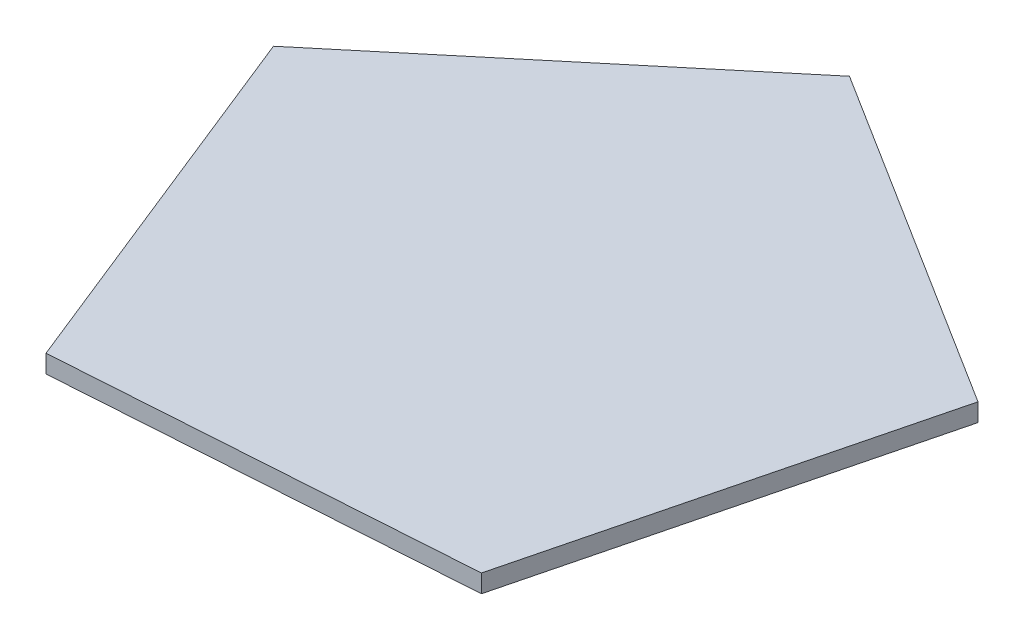
ISO-10303-21;
HEADER;
FILE_DESCRIPTION(('STEP AP214'),'2;1');
FILE_NAME('part.step','',(''),(''),'','','');
FILE_SCHEMA(('AUTOMOTIVE_DESIGN { 1 0 10303 214 1 1 1 1 }'));
ENDSEC;
DATA;
#1=APPLICATION_CONTEXT('core data for automotive mechanical design processes');
#2=APPLICATION_PROTOCOL_DEFINITION('international standard','automotive_design',2000,#1);
#3=PRODUCT_CONTEXT('',#1,'mechanical');
#4=PRODUCT('Part','Part','',(#3));
#5=PRODUCT_RELATED_PRODUCT_CATEGORY('part','',(#4));
#6=PRODUCT_DEFINITION_FORMATION('','',#4);
#7=PRODUCT_DEFINITION_CONTEXT('part definition',#1,'design');
#8=PRODUCT_DEFINITION('design','',#6,#7);
#9=PRODUCT_DEFINITION_SHAPE('','',#8);
#10=(LENGTH_UNIT() NAMED_UNIT(*) SI_UNIT(.MILLI.,.METRE.));
#11=(NAMED_UNIT(*) PLANE_ANGLE_UNIT() SI_UNIT($,.RADIAN.));
#12=(NAMED_UNIT(*) SI_UNIT($,.STERADIAN.) SOLID_ANGLE_UNIT());
#13=UNCERTAINTY_MEASURE_WITH_UNIT(LENGTH_MEASURE(1.E-05),#10,'distance_accuracy_value','');
#14=(GEOMETRIC_REPRESENTATION_CONTEXT(3) GLOBAL_UNCERTAINTY_ASSIGNED_CONTEXT((#13)) GLOBAL_UNIT_ASSIGNED_CONTEXT((#10,
#11,#12)) REPRESENTATION_CONTEXT('',''));
#15=CARTESIAN_POINT('',(0.,0.,0.));
#16=DIRECTION('',(0.,0.,1.));
#17=DIRECTION('',(1.,0.,0.));
#18=AXIS2_PLACEMENT_3D('',#15,#16,#17);
#19=CARTESIAN_POINT('',(-4.13996367919021,3.2,-61.6645831351842));
#20=DIRECTION('',(0.640657864274961,0.,0.767826478406837));
#21=DIRECTION('',(0.767826478406837,0.,-0.640657864274961));
#22=AXIS2_PLACEMENT_3D('',#19,#20,#21);
#23=PLANE('',#22);
#24=DIRECTION('',(-0.767826478406837,0.,0.640657864274961));
#25=VECTOR('',#24,1.);
#26=CARTESIAN_POINT('',(-4.13996367919021,0.,-61.6645831351842));
#27=LINE('',#26,#25);
#28=CARTESIAN_POINT('',(-4.13996367919021,0.,-61.6645831351842));
#29=VERTEX_POINT('',#28);
#30=CARTESIAN_POINT('',(-59.9258227483059,0.,-15.1180647054996));
#31=VERTEX_POINT('',#30);
#32=EDGE_CURVE('E118',#29,#31,#27,.T.);
#33=ORIENTED_EDGE('',*,*,#32,.T.);
#34=DIRECTION('',(0.,-1.,0.));
#35=VECTOR('',#34,1.);
#36=CARTESIAN_POINT('',(-59.9258227483059,3.2,-15.1180647054996));
#37=LINE('',#36,#35);
#38=CARTESIAN_POINT('',(-59.9258227483059,3.2,-15.1180647054996));
#39=VERTEX_POINT('',#38);
#40=EDGE_CURVE('E11',#39,#31,#37,.T.);
#41=ORIENTED_EDGE('',*,*,#40,.F.);
#42=DIRECTION('',(-0.767826478406837,0.,0.640657864274961));
#43=VECTOR('',#42,1.);
#44=CARTESIAN_POINT('',(-4.13996367919021,3.2,-61.6645831351842));
#45=LINE('',#44,#43);
#46=CARTESIAN_POINT('',(-4.13996367919021,3.2,-61.6645831351842));
#47=VERTEX_POINT('',#46);
#48=EDGE_CURVE('E131',#47,#39,#45,.T.);
#49=ORIENTED_EDGE('',*,*,#48,.F.);
#50=DIRECTION('',(0.,-1.,0.));
#51=VECTOR('',#50,1.);
#52=CARTESIAN_POINT('',(-4.13996367919021,3.2,-61.6645831351842));
#53=LINE('',#52,#51);
#54=EDGE_CURVE('E114',#47,#29,#53,.T.);
#55=ORIENTED_EDGE('',*,*,#54,.T.);
#56=EDGE_LOOP('',(#33,#41,#49,#55));
#57=FACE_BOUND('',#56,.T.);
#58=ADVANCED_FACE('F39',(#57),#23,.F.);
#59=CARTESIAN_POINT('',(-59.9258227483059,3.2,-15.1180647054996));
#60=DIRECTION('',(0.928220543313704,0.,-0.372030405975657));
#61=DIRECTION('',(-0.372030405975657,0.,-0.928220543313704));
#62=AXIS2_PLACEMENT_3D('',#59,#60,#61);
#63=PLANE('',#62);
#64=DIRECTION('',(0.372030405975657,0.,0.928220543313704));
#65=VECTOR('',#64,1.);
#66=CARTESIAN_POINT('',(-59.9258227483059,0.,-15.1180647054996));
#67=LINE('',#66,#65);
#68=CARTESIAN_POINT('',(-32.8962315830645,0.,52.3211053030653));
#69=VERTEX_POINT('',#68);
#70=EDGE_CURVE('E122',#31,#69,#67,.T.);
#71=ORIENTED_EDGE('',*,*,#70,.T.);
#72=DIRECTION('',(0.,-1.,0.));
#73=VECTOR('',#72,1.);
#74=CARTESIAN_POINT('',(-32.8962315830645,3.2,52.3211053030653));
#75=LINE('',#74,#73);
#76=CARTESIAN_POINT('',(-32.8962315830645,3.2,52.3211053030653));
#77=VERTEX_POINT('',#76);
#78=EDGE_CURVE('E48',#77,#69,#75,.T.);
#79=ORIENTED_EDGE('',*,*,#78,.F.);
#80=DIRECTION('',(0.372030405975657,0.,0.928220543313704));
#81=VECTOR('',#80,1.);
#82=CARTESIAN_POINT('',(-59.9258227483059,3.2,-15.1180647054996));
#83=LINE('',#82,#81);
#84=EDGE_CURVE('E90',#39,#77,#83,.T.);
#85=ORIENTED_EDGE('',*,*,#84,.F.);
#86=ORIENTED_EDGE('',*,*,#40,.T.);
#87=EDGE_LOOP('',(#71,#79,#85,#86));
#88=FACE_BOUND('',#87,.T.);
#89=ADVANCED_FACE('F153',(#88),#63,.F.);
#90=CARTESIAN_POINT('',(-32.8962315830645,3.2,52.3211053030653));
#91=DIRECTION('',(-0.0669860194511983,0.,-0.997753914148215));
#92=DIRECTION('',(-0.997753914148215,0.,0.0669860194511983));
#93=AXIS2_PLACEMENT_3D('',#90,#91,#92);
#94=PLANE('',#93);
#95=DIRECTION('',(0.997753914148215,0.,-0.0669860194511983));
#96=VECTOR('',#95,1.);
#97=CARTESIAN_POINT('',(-32.8962315830645,0.,52.3211053030653));
#98=LINE('',#97,#96);
#99=CARTESIAN_POINT('',(39.5948335281843,0.,47.4542861117563));
#100=VERTEX_POINT('',#99);
#101=EDGE_CURVE('E106',#69,#100,#98,.T.);
#102=ORIENTED_EDGE('',*,*,#101,.T.);
#103=DIRECTION('',(0.,-1.,0.));
#104=VECTOR('',#103,1.);
#105=CARTESIAN_POINT('',(39.5948335281843,3.2,47.4542861117563));
#106=LINE('',#105,#104);
#107=CARTESIAN_POINT('',(39.5948335281843,3.2,47.4542861117563));
#108=VERTEX_POINT('',#107);
#109=EDGE_CURVE('E103',#108,#100,#106,.T.);
#110=ORIENTED_EDGE('',*,*,#109,.F.);
#111=DIRECTION('',(0.997753914148215,0.,-0.0669860194511983));
#112=VECTOR('',#111,1.);
#113=CARTESIAN_POINT('',(-32.8962315830645,3.2,52.3211053030653));
#114=LINE('',#113,#112);
#115=EDGE_CURVE('E94',#77,#108,#114,.T.);
#116=ORIENTED_EDGE('',*,*,#115,.F.);
#117=ORIENTED_EDGE('',*,*,#78,.T.);
#118=EDGE_LOOP('',(#102,#110,#116,#117));
#119=FACE_BOUND('',#118,.T.);
#120=ADVANCED_FACE('F104',(#119),#94,.F.);
#121=CARTESIAN_POINT('',(39.5948335281843,3.2,47.4542861117563));
#122=DIRECTION('',(-0.969620180105606,0.,-0.244615425376185));
#123=DIRECTION('',(-0.244615425376185,0.,0.969620180105606));
#124=AXIS2_PLACEMENT_3D('',#121,#122,#123);
#125=PLANE('',#124);
#126=DIRECTION('',(0.244615425376185,0.,-0.969620180105606));
#127=VECTOR('',#126,1.);
#128=CARTESIAN_POINT('',(39.5948335281843,0.,47.4542861117563));
#129=LINE('',#128,#127);
#130=CARTESIAN_POINT('',(57.3671844823763,0.,-22.9927435741378));
#131=VERTEX_POINT('',#130);
#132=EDGE_CURVE('E76',#100,#131,#129,.T.);
#133=ORIENTED_EDGE('',*,*,#132,.T.);
#134=DIRECTION('',(0.,-1.,0.));
#135=VECTOR('',#134,1.);
#136=CARTESIAN_POINT('',(57.3671844823763,3.2,-22.9927435741378));
#137=LINE('',#136,#135);
#138=CARTESIAN_POINT('',(57.3671844823763,3.2,-22.9927435741378));
#139=VERTEX_POINT('',#138);
#140=EDGE_CURVE('E108',#139,#131,#137,.T.);
#141=ORIENTED_EDGE('',*,*,#140,.F.);
#142=DIRECTION('',(0.244615425376185,0.,-0.969620180105606));
#143=VECTOR('',#142,1.);
#144=CARTESIAN_POINT('',(39.5948335281843,3.2,47.4542861117563));
#145=LINE('',#144,#143);
#146=EDGE_CURVE('E98',#108,#139,#145,.T.);
#147=ORIENTED_EDGE('',*,*,#146,.F.);
#148=ORIENTED_EDGE('',*,*,#109,.T.);
#149=EDGE_LOOP('',(#133,#141,#147,#148));
#150=FACE_BOUND('',#149,.T.);
#151=ADVANCED_FACE('F110',(#150),#125,.F.);
#152=CARTESIAN_POINT('',(57.3671844823763,3.2,-22.9927435741378));
#153=DIRECTION('',(-0.532272208031861,0.,0.846573267093219));
#154=DIRECTION('',(0.846573267093219,0.,0.532272208031861));
#155=AXIS2_PLACEMENT_3D('',#152,#153,#154);
#156=PLANE('',#155);
#157=DIRECTION('',(-0.846573267093219,0.,-0.532272208031861));
#158=VECTOR('',#157,1.);
#159=CARTESIAN_POINT('',(57.3671844823763,0.,-22.9927435741378));
#160=LINE('',#159,#158);
#161=EDGE_CURVE('E82',#131,#29,#160,.T.);
#162=ORIENTED_EDGE('',*,*,#161,.T.);
#163=ORIENTED_EDGE('',*,*,#54,.F.);
#164=DIRECTION('',(-0.846573267093219,0.,-0.532272208031861));
#165=VECTOR('',#164,1.);
#166=CARTESIAN_POINT('',(57.3671844823763,3.2,-22.9927435741378));
#167=LINE('',#166,#165);
#168=EDGE_CURVE('E56',#139,#47,#167,.T.);
#169=ORIENTED_EDGE('',*,*,#168,.F.);
#170=ORIENTED_EDGE('',*,*,#140,.T.);
#171=EDGE_LOOP('',(#162,#163,#169,#170));
#172=FACE_BOUND('',#171,.T.);
#173=ADVANCED_FACE('F142',(#172),#156,.F.);
#174=CARTESIAN_POINT('',(0.,3.2,0.));
#175=DIRECTION('',(0.,1.,0.));
#176=DIRECTION('',(0.,0.,1.));
#177=AXIS2_PLACEMENT_3D('',#174,#175,#176);
#178=PLANE('',#177);
#179=ORIENTED_EDGE('',*,*,#48,.T.);
#180=ORIENTED_EDGE('',*,*,#84,.T.);
#181=ORIENTED_EDGE('',*,*,#115,.T.);
#182=ORIENTED_EDGE('',*,*,#146,.T.);
#183=ORIENTED_EDGE('',*,*,#168,.T.);
#184=EDGE_LOOP('',(#179,#180,#181,#182,#183));
#185=FACE_BOUND('',#184,.T.);
#186=ADVANCED_FACE('F96',(#185),#178,.T.);
#187=CARTESIAN_POINT('',(0.,0.,0.));
#188=DIRECTION('',(0.,1.,0.));
#189=DIRECTION('',(0.,0.,1.));
#190=AXIS2_PLACEMENT_3D('',#187,#188,#189);
#191=PLANE('',#190);
#192=ORIENTED_EDGE('',*,*,#32,.F.);
#193=ORIENTED_EDGE('',*,*,#161,.F.);
#194=ORIENTED_EDGE('',*,*,#132,.F.);
#195=ORIENTED_EDGE('',*,*,#101,.F.);
#196=ORIENTED_EDGE('',*,*,#70,.F.);
#197=EDGE_LOOP('',(#192,#193,#194,#195,#196));
#198=FACE_BOUND('',#197,.T.);
#199=ADVANCED_FACE('F138',(#198),#191,.F.);
#200=CLOSED_SHELL('',(#58,#89,#120,#151,#173,#186,#199));
#201=MANIFOLD_SOLID_BREP('B2',#200);
#202=ADVANCED_BREP_SHAPE_REPRESENTATION('',(#18,#201),#14);
#203=SHAPE_DEFINITION_REPRESENTATION(#9,#202);
ENDSEC;
END-ISO-10303-21;
